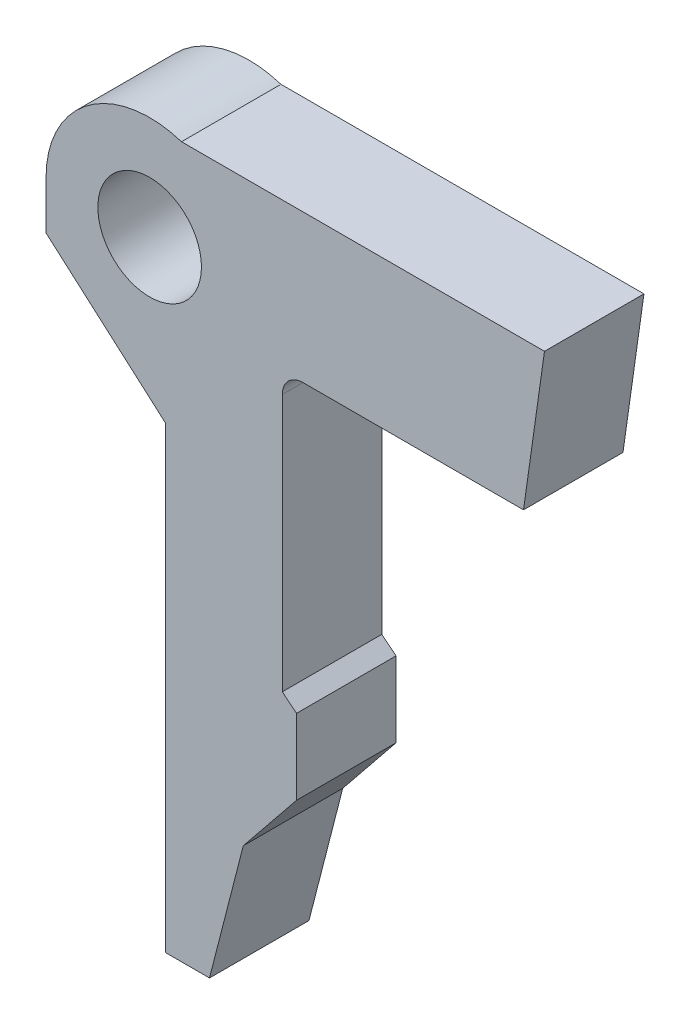
ISO-10303-21;
HEADER;
FILE_DESCRIPTION(('STEP AP214'),'2;1');
FILE_NAME('part.step','',(''),(''),'','','');
FILE_SCHEMA(('AUTOMOTIVE_DESIGN { 1 0 10303 214 1 1 1 1 }'));
ENDSEC;
DATA;
#1=APPLICATION_CONTEXT('core data for automotive mechanical design processes');
#2=APPLICATION_PROTOCOL_DEFINITION('international standard','automotive_design',2000,#1);
#3=PRODUCT_CONTEXT('',#1,'mechanical');
#4=PRODUCT('Part','Part','',(#3));
#5=PRODUCT_RELATED_PRODUCT_CATEGORY('part','',(#4));
#6=PRODUCT_DEFINITION_FORMATION('','',#4);
#7=PRODUCT_DEFINITION_CONTEXT('part definition',#1,'design');
#8=PRODUCT_DEFINITION('design','',#6,#7);
#9=PRODUCT_DEFINITION_SHAPE('','',#8);
#10=(LENGTH_UNIT() NAMED_UNIT(*) SI_UNIT(.MILLI.,.METRE.));
#11=(NAMED_UNIT(*) PLANE_ANGLE_UNIT() SI_UNIT($,.RADIAN.));
#12=(NAMED_UNIT(*) SI_UNIT($,.STERADIAN.) SOLID_ANGLE_UNIT());
#13=UNCERTAINTY_MEASURE_WITH_UNIT(LENGTH_MEASURE(1.E-05),#10,'distance_accuracy_value','');
#14=(GEOMETRIC_REPRESENTATION_CONTEXT(3) GLOBAL_UNCERTAINTY_ASSIGNED_CONTEXT((#13)) GLOBAL_UNIT_ASSIGNED_CONTEXT((#10,
#11,#12)) REPRESENTATION_CONTEXT('',''));
#15=CARTESIAN_POINT('',(0.,0.,0.));
#16=DIRECTION('',(0.,0.,1.));
#17=DIRECTION('',(1.,0.,0.));
#18=AXIS2_PLACEMENT_3D('',#15,#16,#17);
#19=CARTESIAN_POINT('',(6.40208237027269,0.,4.8));
#20=DIRECTION('',(-1.,0.,0.));
#21=DIRECTION('',(0.,-1.,0.));
#22=AXIS2_PLACEMENT_3D('',#19,#20,#21);
#23=PLANE('',#22);
#24=DIRECTION('',(0.,1.,0.));
#25=VECTOR('',#24,1.);
#26=CARTESIAN_POINT('',(6.40208237027269,0.,0.));
#27=LINE('',#26,#25);
#28=CARTESIAN_POINT('',(6.40208237027269,-15.8013424147127,0.));
#29=VERTEX_POINT('',#28);
#30=CARTESIAN_POINT('',(6.40208237027269,-3.37613806837089,0.));
#31=VERTEX_POINT('',#30);
#32=EDGE_CURVE('E171',#29,#31,#27,.T.);
#33=ORIENTED_EDGE('',*,*,#32,.T.);
#34=DIRECTION('',(0.,0.,-1.));
#35=VECTOR('',#34,1.);
#36=CARTESIAN_POINT('',(6.40208237027269,-3.37613806837089,4.8));
#37=LINE('',#36,#35);
#38=CARTESIAN_POINT('',(6.40208237027269,-3.37613806837089,4.8));
#39=VERTEX_POINT('',#38);
#40=EDGE_CURVE('E11',#39,#31,#37,.T.);
#41=ORIENTED_EDGE('',*,*,#40,.F.);
#42=DIRECTION('',(0.,1.,0.));
#43=VECTOR('',#42,1.);
#44=CARTESIAN_POINT('',(6.40208237027269,0.,4.8));
#45=LINE('',#44,#43);
#46=CARTESIAN_POINT('',(6.40208237027269,-15.8013424147127,4.8));
#47=VERTEX_POINT('',#46);
#48=EDGE_CURVE('E201',#47,#39,#45,.T.);
#49=ORIENTED_EDGE('',*,*,#48,.F.);
#50=DIRECTION('',(0.,0.,-1.));
#51=VECTOR('',#50,1.);
#52=CARTESIAN_POINT('',(6.40208237027269,-15.8013424147127,4.8));
#53=LINE('',#52,#51);
#54=EDGE_CURVE('E170',#47,#29,#53,.T.);
#55=ORIENTED_EDGE('',*,*,#54,.T.);
#56=EDGE_LOOP('',(#33,#41,#49,#55));
#57=FACE_BOUND('',#56,.T.);
#58=ADVANCED_FACE('F35',(#57),#23,.F.);
#59=CARTESIAN_POINT('',(7.40208237027269,-3.37613806837089,4.8));
#60=DIRECTION('',(0.,0.,-1.));
#61=DIRECTION('',(-1.,0.,0.));
#62=AXIS2_PLACEMENT_3D('',#59,#60,#61);
#63=CYLINDRICAL_SURFACE('',#62,1.);
#64=CARTESIAN_POINT('',(7.40208237027269,-3.37613806837089,0.));
#65=DIRECTION('',(0.,0.,1.));
#66=DIRECTION('',(1.,0.,0.));
#67=AXIS2_PLACEMENT_3D('',#64,#65,#66);
#68=CIRCLE('',#67,1.);
#69=CARTESIAN_POINT('',(7.40208237027269,-2.37613806837089,0.));
#70=VERTEX_POINT('',#69);
#71=EDGE_CURVE('E174',#31,#70,#68,.F.);
#72=ORIENTED_EDGE('',*,*,#71,.T.);
#73=DIRECTION('',(0.,0.,-1.));
#74=VECTOR('',#73,1.);
#75=CARTESIAN_POINT('',(7.40208237027269,-2.37613806837089,4.8));
#76=LINE('',#75,#74);
#77=CARTESIAN_POINT('',(7.40208237027269,-2.37613806837089,4.8));
#78=VERTEX_POINT('',#77);
#79=EDGE_CURVE('E43',#78,#70,#76,.T.);
#80=ORIENTED_EDGE('',*,*,#79,.F.);
#81=CARTESIAN_POINT('',(7.40208237027269,-3.37613806837089,4.8));
#82=DIRECTION('',(0.,0.,1.));
#83=DIRECTION('',(1.,0.,0.));
#84=AXIS2_PLACEMENT_3D('',#81,#82,#83);
#85=CIRCLE('',#84,1.);
#86=EDGE_CURVE('E112',#39,#78,#85,.F.);
#87=ORIENTED_EDGE('',*,*,#86,.F.);
#88=ORIENTED_EDGE('',*,*,#40,.T.);
#89=EDGE_LOOP('',(#72,#80,#87,#88));
#90=FACE_BOUND('',#89,.T.);
#91=ADVANCED_FACE('F291',(#90),#63,.F.);
#92=CARTESIAN_POINT('',(0.,-2.37613806837089,4.8));
#93=DIRECTION('',(0.,1.,0.));
#94=DIRECTION('',(0.,0.,1.));
#95=AXIS2_PLACEMENT_3D('',#92,#93,#94);
#96=PLANE('',#95);
#97=DIRECTION('',(1.,0.,0.));
#98=VECTOR('',#97,1.);
#99=CARTESIAN_POINT('',(0.,-2.37613806837089,0.));
#100=LINE('',#99,#98);
#101=CARTESIAN_POINT('',(18.0439607931068,-2.37613806837089,0.));
#102=VERTEX_POINT('',#101);
#103=EDGE_CURVE('E177',#70,#102,#100,.T.);
#104=ORIENTED_EDGE('',*,*,#103,.T.);
#105=DIRECTION('',(0.,0.,-1.));
#106=VECTOR('',#105,1.);
#107=CARTESIAN_POINT('',(18.0439607931068,-2.37613806837089,4.8));
#108=LINE('',#107,#106);
#109=CARTESIAN_POINT('',(18.0439607931068,-2.37613806837089,4.8));
#110=VERTEX_POINT('',#109);
#111=EDGE_CURVE('E226',#110,#102,#108,.T.);
#112=ORIENTED_EDGE('',*,*,#111,.F.);
#113=DIRECTION('',(1.,0.,0.));
#114=VECTOR('',#113,1.);
#115=CARTESIAN_POINT('',(0.,-2.37613806837089,4.8));
#116=LINE('',#115,#114);
#117=EDGE_CURVE('E234',#78,#110,#116,.T.);
#118=ORIENTED_EDGE('',*,*,#117,.F.);
#119=ORIENTED_EDGE('',*,*,#79,.T.);
#120=EDGE_LOOP('',(#104,#112,#118,#119));
#121=FACE_BOUND('',#120,.T.);
#122=ADVANCED_FACE('F232',(#121),#96,.F.);
#123=CARTESIAN_POINT('',(18.0184346235268,-2.55607840833381,4.8));
#124=DIRECTION('',(-0.990087364863809,0.140452874434947,0.));
#125=DIRECTION('',(-0.140452874434947,-0.990087364863809,0.));
#126=AXIS2_PLACEMENT_3D('',#123,#124,#125);
#127=PLANE('',#126);
#128=DIRECTION('',(0.140452874434947,0.990087364863809,0.));
#129=VECTOR('',#128,1.);
#130=CARTESIAN_POINT('',(18.0184346235268,-2.55607840833381,0.));
#131=LINE('',#130,#129);
#132=CARTESIAN_POINT('',(19.0560025989645,4.7579971974597,0.));
#133=VERTEX_POINT('',#132);
#134=EDGE_CURVE('E179',#102,#133,#131,.T.);
#135=ORIENTED_EDGE('',*,*,#134,.T.);
#136=DIRECTION('',(0.,0.,-1.));
#137=VECTOR('',#136,1.);
#138=CARTESIAN_POINT('',(19.0560025989645,4.7579971974597,4.8));
#139=LINE('',#138,#137);
#140=CARTESIAN_POINT('',(19.0560025989645,4.7579971974597,4.8));
#141=VERTEX_POINT('',#140);
#142=EDGE_CURVE('E223',#141,#133,#139,.T.);
#143=ORIENTED_EDGE('',*,*,#142,.F.);
#144=DIRECTION('',(0.140452874434947,0.990087364863809,0.));
#145=VECTOR('',#144,1.);
#146=CARTESIAN_POINT('',(18.0184346235268,-2.55607840833381,4.8));
#147=LINE('',#146,#145);
#148=EDGE_CURVE('E253',#110,#141,#147,.T.);
#149=ORIENTED_EDGE('',*,*,#148,.F.);
#150=ORIENTED_EDGE('',*,*,#111,.T.);
#151=EDGE_LOOP('',(#135,#143,#149,#150));
#152=FACE_BOUND('',#151,.T.);
#153=ADVANCED_FACE('F244',(#152),#127,.F.);
#154=CARTESIAN_POINT('',(0.,4.7579971974597,4.8));
#155=DIRECTION('',(0.,-1.,0.));
#156=DIRECTION('',(0.,0.,-1.));
#157=AXIS2_PLACEMENT_3D('',#154,#155,#156);
#158=PLANE('',#157);
#159=DIRECTION('',(-1.,0.,0.));
#160=VECTOR('',#159,1.);
#161=CARTESIAN_POINT('',(0.,4.7579971974597,0.));
#162=LINE('',#161,#160);
#163=CARTESIAN_POINT('',(1.53670513403374,4.7579971974597,0.));
#164=VERTEX_POINT('',#163);
#165=EDGE_CURVE('E181',#133,#164,#162,.T.);
#166=ORIENTED_EDGE('',*,*,#165,.T.);
#167=DIRECTION('',(0.,0.,-1.));
#168=VECTOR('',#167,1.);
#169=CARTESIAN_POINT('',(1.53670513403374,4.7579971974597,4.8));
#170=LINE('',#169,#168);
#171=CARTESIAN_POINT('',(1.53670513403374,4.7579971974597,4.8));
#172=VERTEX_POINT('',#171);
#173=EDGE_CURVE('E220',#172,#164,#170,.T.);
#174=ORIENTED_EDGE('',*,*,#173,.F.);
#175=DIRECTION('',(-1.,0.,0.));
#176=VECTOR('',#175,1.);
#177=CARTESIAN_POINT('',(0.,4.7579971974597,4.8));
#178=LINE('',#177,#176);
#179=EDGE_CURVE('E250',#141,#172,#178,.T.);
#180=ORIENTED_EDGE('',*,*,#179,.F.);
#181=ORIENTED_EDGE('',*,*,#142,.T.);
#182=EDGE_LOOP('',(#166,#174,#180,#181));
#183=FACE_BOUND('',#182,.T.);
#184=ADVANCED_FACE('F248',(#183),#158,.F.);
#185=CARTESIAN_POINT('',(0.,0.,4.8));
#186=DIRECTION('',(0.,0.,-1.));
#187=DIRECTION('',(-1.,0.,0.));
#188=AXIS2_PLACEMENT_3D('',#185,#186,#187);
#189=CYLINDRICAL_SURFACE('',#188,5.);
#190=CARTESIAN_POINT('',(0.,0.,0.));
#191=DIRECTION('',(0.,0.,1.));
#192=DIRECTION('',(1.,0.,0.));
#193=AXIS2_PLACEMENT_3D('',#190,#191,#192);
#194=CIRCLE('',#193,5.);
#195=CARTESIAN_POINT('',(-5.,0.,0.));
#196=VERTEX_POINT('',#195);
#197=EDGE_CURVE('E183',#164,#196,#194,.T.);
#198=ORIENTED_EDGE('',*,*,#197,.T.);
#199=DIRECTION('',(0.,0.,-1.));
#200=VECTOR('',#199,1.);
#201=CARTESIAN_POINT('',(-5.,0.,4.8));
#202=LINE('',#201,#200);
#203=CARTESIAN_POINT('',(-5.,0.,4.8));
#204=VERTEX_POINT('',#203);
#205=EDGE_CURVE('E217',#204,#196,#202,.T.);
#206=ORIENTED_EDGE('',*,*,#205,.F.);
#207=CARTESIAN_POINT('',(0.,0.,4.8));
#208=DIRECTION('',(0.,0.,1.));
#209=DIRECTION('',(1.,0.,0.));
#210=AXIS2_PLACEMENT_3D('',#207,#208,#209);
#211=CIRCLE('',#210,5.);
#212=EDGE_CURVE('E252',#172,#204,#211,.T.);
#213=ORIENTED_EDGE('',*,*,#212,.F.);
#214=ORIENTED_EDGE('',*,*,#173,.T.);
#215=EDGE_LOOP('',(#198,#206,#213,#214));
#216=FACE_BOUND('',#215,.T.);
#217=ADVANCED_FACE('F304',(#216),#189,.T.);
#218=CARTESIAN_POINT('',(-5.,0.,4.8));
#219=DIRECTION('',(1.,0.,0.));
#220=DIRECTION('',(0.,0.,-1.));
#221=AXIS2_PLACEMENT_3D('',#218,#219,#220);
#222=PLANE('',#221);
#223=DIRECTION('',(0.,-1.,0.));
#224=VECTOR('',#223,1.);
#225=CARTESIAN_POINT('',(-5.,0.,0.));
#226=LINE('',#225,#224);
#227=CARTESIAN_POINT('',(-5.,-2.32647439688253,0.));
#228=VERTEX_POINT('',#227);
#229=EDGE_CURVE('E185',#196,#228,#226,.T.);
#230=ORIENTED_EDGE('',*,*,#229,.T.);
#231=DIRECTION('',(0.,0.,-1.));
#232=VECTOR('',#231,1.);
#233=CARTESIAN_POINT('',(-5.,-2.32647439688253,4.8));
#234=LINE('',#233,#232);
#235=CARTESIAN_POINT('',(-5.,-2.32647439688253,4.8));
#236=VERTEX_POINT('',#235);
#237=EDGE_CURVE('E214',#236,#228,#234,.T.);
#238=ORIENTED_EDGE('',*,*,#237,.F.);
#239=DIRECTION('',(0.,-1.,0.));
#240=VECTOR('',#239,1.);
#241=CARTESIAN_POINT('',(-5.,0.,4.8));
#242=LINE('',#241,#240);
#243=EDGE_CURVE('E255',#204,#236,#242,.T.);
#244=ORIENTED_EDGE('',*,*,#243,.F.);
#245=ORIENTED_EDGE('',*,*,#205,.T.);
#246=EDGE_LOOP('',(#230,#238,#244,#245));
#247=FACE_BOUND('',#246,.T.);
#248=ADVANCED_FACE('F307',(#247),#222,.F.);
#249=CARTESIAN_POINT('',(-3.32960365921922,-3.79285286398016,4.8));
#250=DIRECTION('',(0.659722162079872,0.751509593325767,0.));
#251=DIRECTION('',(-0.751509593325767,0.659722162079872,0.));
#252=AXIS2_PLACEMENT_3D('',#249,#250,#251);
#253=PLANE('',#252);
#254=DIRECTION('',(0.751509593325767,-0.659722162079872,0.));
#255=VECTOR('',#254,1.);
#256=CARTESIAN_POINT('',(-3.32960365921922,-3.79285286398016,0.));
#257=LINE('',#256,#255);
#258=CARTESIAN_POINT('',(0.754164722411706,-7.3778403745722,0.));
#259=VERTEX_POINT('',#258);
#260=EDGE_CURVE('E187',#228,#259,#257,.T.);
#261=ORIENTED_EDGE('',*,*,#260,.T.);
#262=DIRECTION('',(0.,0.,-1.));
#263=VECTOR('',#262,1.);
#264=CARTESIAN_POINT('',(0.754164722411706,-7.3778403745722,4.8));
#265=LINE('',#264,#263);
#266=CARTESIAN_POINT('',(0.754164722411706,-7.3778403745722,4.8));
#267=VERTEX_POINT('',#266);
#268=EDGE_CURVE('E211',#267,#259,#265,.T.);
#269=ORIENTED_EDGE('',*,*,#268,.F.);
#270=DIRECTION('',(0.751509593325767,-0.659722162079872,0.));
#271=VECTOR('',#270,1.);
#272=CARTESIAN_POINT('',(-3.32960365921922,-3.79285286398016,4.8));
#273=LINE('',#272,#271);
#274=EDGE_CURVE('E261',#236,#267,#273,.T.);
#275=ORIENTED_EDGE('',*,*,#274,.F.);
#276=ORIENTED_EDGE('',*,*,#237,.T.);
#277=EDGE_LOOP('',(#261,#269,#275,#276));
#278=FACE_BOUND('',#277,.T.);
#279=ADVANCED_FACE('F311',(#278),#253,.F.);
#280=CARTESIAN_POINT('',(0.754164722411706,0.,4.8));
#281=DIRECTION('',(1.,0.,0.));
#282=DIRECTION('',(0.,0.,-1.));
#283=AXIS2_PLACEMENT_3D('',#280,#281,#282);
#284=PLANE('',#283);
#285=CARTESIAN_POINT('',(0.754164722411706,-27.0198901160511,2.4));
#286=DIRECTION('',(-1.,0.,0.));
#287=DIRECTION('',(0.,0.,1.));
#288=AXIS2_PLACEMENT_3D('',#285,#286,#287);
#289=CIRCLE('',#288,1.825);
#290=CARTESIAN_POINT('',(0.754164722411706,-27.0198901160511,4.225));
#291=VERTEX_POINT('',#290);
#292=EDGE_CURVE('E395',#291,#291,#289,.T.);
#293=ORIENTED_EDGE('',*,*,#292,.F.);
#294=EDGE_LOOP('',(#293));
#295=FACE_BOUND('',#294,.T.);
#296=DIRECTION('',(0.,-1.,0.));
#297=VECTOR('',#296,1.);
#298=CARTESIAN_POINT('',(0.754164722411706,0.,0.));
#299=LINE('',#298,#297);
#300=CARTESIAN_POINT('',(0.754164722411706,-29.5198901160511,0.));
#301=VERTEX_POINT('',#300);
#302=EDGE_CURVE('E189',#259,#301,#299,.T.);
#303=ORIENTED_EDGE('',*,*,#302,.T.);
#304=DIRECTION('',(0.,0.,-1.));
#305=VECTOR('',#304,1.);
#306=CARTESIAN_POINT('',(0.754164722411706,-29.5198901160511,4.8));
#307=LINE('',#306,#305);
#308=CARTESIAN_POINT('',(0.754164722411706,-29.5198901160511,4.8));
#309=VERTEX_POINT('',#308);
#310=EDGE_CURVE('E208',#309,#301,#307,.T.);
#311=ORIENTED_EDGE('',*,*,#310,.F.);
#312=DIRECTION('',(0.,-1.,0.));
#313=VECTOR('',#312,1.);
#314=CARTESIAN_POINT('',(0.754164722411706,0.,4.8));
#315=LINE('',#314,#313);
#316=EDGE_CURVE('E263',#267,#309,#315,.T.);
#317=ORIENTED_EDGE('',*,*,#316,.F.);
#318=ORIENTED_EDGE('',*,*,#268,.T.);
#319=EDGE_LOOP('',(#303,#311,#317,#318));
#320=FACE_BOUND('',#319,.T.);
#321=ADVANCED_FACE('F315',(#295,#320),#284,.F.);
#322=CARTESIAN_POINT('',(0.,-29.5198901160511,4.8));
#323=DIRECTION('',(0.,1.,0.));
#324=DIRECTION('',(0.,0.,1.));
#325=AXIS2_PLACEMENT_3D('',#322,#323,#324);
#326=PLANE('',#325);
#327=DIRECTION('',(1.,0.,0.));
#328=VECTOR('',#327,1.);
#329=CARTESIAN_POINT('',(0.,-29.5198901160511,0.));
#330=LINE('',#329,#328);
#331=CARTESIAN_POINT('',(2.88905288160279,-29.5198901160511,0.));
#332=VERTEX_POINT('',#331);
#333=EDGE_CURVE('E191',#301,#332,#330,.T.);
#334=ORIENTED_EDGE('',*,*,#333,.T.);
#335=DIRECTION('',(0.,0.,-1.));
#336=VECTOR('',#335,1.);
#337=CARTESIAN_POINT('',(2.88905288160279,-29.5198901160511,4.8));
#338=LINE('',#337,#336);
#339=CARTESIAN_POINT('',(2.88905288160279,-29.5198901160511,4.8));
#340=VERTEX_POINT('',#339);
#341=EDGE_CURVE('E205',#340,#332,#338,.T.);
#342=ORIENTED_EDGE('',*,*,#341,.F.);
#343=DIRECTION('',(1.,0.,0.));
#344=VECTOR('',#343,1.);
#345=CARTESIAN_POINT('',(0.,-29.5198901160511,4.8));
#346=LINE('',#345,#344);
#347=EDGE_CURVE('E265',#309,#340,#346,.T.);
#348=ORIENTED_EDGE('',*,*,#347,.F.);
#349=ORIENTED_EDGE('',*,*,#310,.T.);
#350=EDGE_LOOP('',(#334,#342,#348,#349));
#351=FACE_BOUND('',#350,.T.);
#352=ADVANCED_FACE('F271',(#351),#326,.F.);
#353=CARTESIAN_POINT('',(9.82465163114794,-2.52409050886445,4.8));
#354=DIRECTION('',(-0.968546374107557,0.248833119184534,0.));
#355=DIRECTION('',(-0.248833119184534,-0.968546374107557,0.));
#356=AXIS2_PLACEMENT_3D('',#353,#354,#355);
#357=PLANE('',#356);
#358=DIRECTION('',(0.248833119184534,0.968546374107557,0.));
#359=VECTOR('',#358,1.);
#360=CARTESIAN_POINT('',(9.82465163114794,-2.52409050886445,0.));
#361=LINE('',#360,#359);
#362=CARTESIAN_POINT('',(4.51852156443268,-23.1774225633041,0.));
#363=VERTEX_POINT('',#362);
#364=EDGE_CURVE('E193',#332,#363,#361,.T.);
#365=ORIENTED_EDGE('',*,*,#364,.T.);
#366=DIRECTION('',(0.,0.,-1.));
#367=VECTOR('',#366,1.);
#368=CARTESIAN_POINT('',(4.51852156443268,-23.1774225633041,4.8));
#369=LINE('',#368,#367);
#370=CARTESIAN_POINT('',(4.51852156443268,-23.1774225633041,4.8));
#371=VERTEX_POINT('',#370);
#372=EDGE_CURVE('E159',#371,#363,#369,.T.);
#373=ORIENTED_EDGE('',*,*,#372,.F.);
#374=DIRECTION('',(0.248833119184534,0.968546374107557,0.));
#375=VECTOR('',#374,1.);
#376=CARTESIAN_POINT('',(9.82465163114794,-2.52409050886445,4.8));
#377=LINE('',#376,#375);
#378=EDGE_CURVE('E150',#340,#371,#377,.T.);
#379=ORIENTED_EDGE('',*,*,#378,.F.);
#380=ORIENTED_EDGE('',*,*,#341,.T.);
#381=EDGE_LOOP('',(#365,#373,#379,#380));
#382=FACE_BOUND('',#381,.T.);
#383=ADVANCED_FACE('F275',(#382),#357,.F.);
#384=CARTESIAN_POINT('',(14.0636657935464,-11.3468212652477,4.8));
#385=DIRECTION('',(-0.778273612677989,0.627925301137923,0.));
#386=DIRECTION('',(-0.627925301137924,-0.778273612677989,0.));
#387=AXIS2_PLACEMENT_3D('',#384,#385,#386);
#388=PLANE('',#387);
#389=DIRECTION('',(0.627925301137924,0.778273612677989,0.));
#390=VECTOR('',#389,1.);
#391=CARTESIAN_POINT('',(14.0636657935464,-11.3468212652477,0.));
#392=LINE('',#391,#390);
#393=CARTESIAN_POINT('',(7.08991093954301,-19.9903484082378,0.));
#394=VERTEX_POINT('',#393);
#395=EDGE_CURVE('E158',#363,#394,#392,.T.);
#396=ORIENTED_EDGE('',*,*,#395,.T.);
#397=DIRECTION('',(0.,0.,-1.));
#398=VECTOR('',#397,1.);
#399=CARTESIAN_POINT('',(7.08991093954301,-19.9903484082378,4.8));
#400=LINE('',#399,#398);
#401=CARTESIAN_POINT('',(7.08991093954301,-19.9903484082378,4.8));
#402=VERTEX_POINT('',#401);
#403=EDGE_CURVE('E155',#402,#394,#400,.T.);
#404=ORIENTED_EDGE('',*,*,#403,.F.);
#405=DIRECTION('',(0.627925301137924,0.778273612677989,0.));
#406=VECTOR('',#405,1.);
#407=CARTESIAN_POINT('',(14.0636657935464,-11.3468212652477,4.8));
#408=LINE('',#407,#406);
#409=EDGE_CURVE('E143',#371,#402,#408,.T.);
#410=ORIENTED_EDGE('',*,*,#409,.F.);
#411=ORIENTED_EDGE('',*,*,#372,.T.);
#412=EDGE_LOOP('',(#396,#404,#410,#411));
#413=FACE_BOUND('',#412,.T.);
#414=ADVANCED_FACE('F156',(#413),#388,.F.);
#415=CARTESIAN_POINT('',(7.08991093954301,0.,4.8));
#416=DIRECTION('',(-1.,0.,0.));
#417=DIRECTION('',(0.,0.,1.));
#418=AXIS2_PLACEMENT_3D('',#415,#416,#417);
#419=PLANE('',#418);
#420=DIRECTION('',(0.,1.,0.));
#421=VECTOR('',#420,1.);
#422=CARTESIAN_POINT('',(7.08991093954301,0.,0.));
#423=LINE('',#422,#421);
#424=CARTESIAN_POINT('',(7.08991093954301,-16.356295010374,0.));
#425=VERTEX_POINT('',#424);
#426=EDGE_CURVE('E98',#394,#425,#423,.T.);
#427=ORIENTED_EDGE('',*,*,#426,.T.);
#428=DIRECTION('',(0.,0.,-1.));
#429=VECTOR('',#428,1.);
#430=CARTESIAN_POINT('',(7.08991093954301,-16.356295010374,4.8));
#431=LINE('',#430,#429);
#432=CARTESIAN_POINT('',(7.08991093954301,-16.356295010374,4.8));
#433=VERTEX_POINT('',#432);
#434=EDGE_CURVE('E160',#433,#425,#431,.T.);
#435=ORIENTED_EDGE('',*,*,#434,.F.);
#436=DIRECTION('',(0.,1.,0.));
#437=VECTOR('',#436,1.);
#438=CARTESIAN_POINT('',(7.08991093954301,0.,4.8));
#439=LINE('',#438,#437);
#440=EDGE_CURVE('E148',#402,#433,#439,.T.);
#441=ORIENTED_EDGE('',*,*,#440,.F.);
#442=ORIENTED_EDGE('',*,*,#403,.T.);
#443=EDGE_LOOP('',(#427,#435,#441,#442));
#444=FACE_BOUND('',#443,.T.);
#445=ADVANCED_FACE('F162',(#444),#419,.F.);
#446=CARTESIAN_POINT('',(-5.19780134365117,-6.44234532734231,4.8));
#447=DIRECTION('',(-0.627925301137923,-0.778273612677989,0.));
#448=DIRECTION('',(0.778273612677989,-0.627925301137923,0.));
#449=AXIS2_PLACEMENT_3D('',#446,#447,#448);
#450=PLANE('',#449);
#451=DIRECTION('',(-0.778273612677989,0.627925301137923,0.));
#452=VECTOR('',#451,1.);
#453=CARTESIAN_POINT('',(-5.19780134365117,-6.44234532734231,0.));
#454=LINE('',#453,#452);
#455=EDGE_CURVE('E104',#425,#29,#454,.T.);
#456=ORIENTED_EDGE('',*,*,#455,.T.);
#457=ORIENTED_EDGE('',*,*,#54,.F.);
#458=DIRECTION('',(-0.778273612677989,0.627925301137923,0.));
#459=VECTOR('',#458,1.);
#460=CARTESIAN_POINT('',(-5.19780134365117,-6.44234532734231,4.8));
#461=LINE('',#460,#459);
#462=EDGE_CURVE('E51',#433,#47,#461,.T.);
#463=ORIENTED_EDGE('',*,*,#462,.F.);
#464=ORIENTED_EDGE('',*,*,#434,.T.);
#465=EDGE_LOOP('',(#456,#457,#463,#464));
#466=FACE_BOUND('',#465,.T.);
#467=ADVANCED_FACE('F279',(#466),#450,.F.);
#468=CARTESIAN_POINT('',(0.,0.,4.8));
#469=DIRECTION('',(0.,0.,-1.));
#470=DIRECTION('',(-1.,0.,0.));
#471=AXIS2_PLACEMENT_3D('',#468,#469,#470);
#472=CYLINDRICAL_SURFACE('',#471,2.5);
#473=CARTESIAN_POINT('',(0.,0.,4.8));
#474=DIRECTION('',(0.,0.,1.));
#475=DIRECTION('',(1.,0.,0.));
#476=AXIS2_PLACEMENT_3D('',#473,#474,#475);
#477=CIRCLE('',#476,2.5);
#478=CARTESIAN_POINT('',(2.5,0.,4.8));
#479=VERTEX_POINT('',#478);
#480=EDGE_CURVE('E164',#479,#479,#477,.T.);
#481=ORIENTED_EDGE('',*,*,#480,.T.);
#482=EDGE_LOOP('',(#481));
#483=FACE_BOUND('',#482,.T.);
#484=CARTESIAN_POINT('',(0.,0.,0.));
#485=DIRECTION('',(0.,0.,1.));
#486=DIRECTION('',(1.,0.,0.));
#487=AXIS2_PLACEMENT_3D('',#484,#485,#486);
#488=CIRCLE('',#487,2.5);
#489=CARTESIAN_POINT('',(2.5,0.,0.));
#490=VERTEX_POINT('',#489);
#491=EDGE_CURVE('E198',#490,#490,#488,.T.);
#492=ORIENTED_EDGE('',*,*,#491,.F.);
#493=EDGE_LOOP('',(#492));
#494=FACE_BOUND('',#493,.T.);
#495=ADVANCED_FACE('F281',(#483,#494),#472,.F.);
#496=CARTESIAN_POINT('',(0.,0.,4.8));
#497=DIRECTION('',(0.,0.,1.));
#498=DIRECTION('',(1.,0.,0.));
#499=AXIS2_PLACEMENT_3D('',#496,#497,#498);
#500=PLANE('',#499);
#501=ORIENTED_EDGE('',*,*,#48,.T.);
#502=ORIENTED_EDGE('',*,*,#86,.T.);
#503=ORIENTED_EDGE('',*,*,#117,.T.);
#504=ORIENTED_EDGE('',*,*,#148,.T.);
#505=ORIENTED_EDGE('',*,*,#179,.T.);
#506=ORIENTED_EDGE('',*,*,#212,.T.);
#507=ORIENTED_EDGE('',*,*,#243,.T.);
#508=ORIENTED_EDGE('',*,*,#274,.T.);
#509=ORIENTED_EDGE('',*,*,#316,.T.);
#510=ORIENTED_EDGE('',*,*,#347,.T.);
#511=ORIENTED_EDGE('',*,*,#378,.T.);
#512=ORIENTED_EDGE('',*,*,#409,.T.);
#513=ORIENTED_EDGE('',*,*,#440,.T.);
#514=ORIENTED_EDGE('',*,*,#462,.T.);
#515=EDGE_LOOP('',(#501,#502,#503,#504,#505,#506,#507,#508,#509,#510,#511,#512,#513,#514));
#516=FACE_BOUND('',#515,.T.);
#517=ORIENTED_EDGE('',*,*,#480,.F.);
#518=EDGE_LOOP('',(#517));
#519=FACE_BOUND('',#518,.T.);
#520=ADVANCED_FACE('F145',(#516,#519),#500,.T.);
#521=CARTESIAN_POINT('',(0.,0.,0.));
#522=DIRECTION('',(0.,0.,1.));
#523=DIRECTION('',(1.,0.,0.));
#524=AXIS2_PLACEMENT_3D('',#521,#522,#523);
#525=PLANE('',#524);
#526=ORIENTED_EDGE('',*,*,#32,.F.);
#527=ORIENTED_EDGE('',*,*,#455,.F.);
#528=ORIENTED_EDGE('',*,*,#426,.F.);
#529=ORIENTED_EDGE('',*,*,#395,.F.);
#530=ORIENTED_EDGE('',*,*,#364,.F.);
#531=ORIENTED_EDGE('',*,*,#333,.F.);
#532=ORIENTED_EDGE('',*,*,#302,.F.);
#533=ORIENTED_EDGE('',*,*,#260,.F.);
#534=ORIENTED_EDGE('',*,*,#229,.F.);
#535=ORIENTED_EDGE('',*,*,#197,.F.);
#536=ORIENTED_EDGE('',*,*,#165,.F.);
#537=ORIENTED_EDGE('',*,*,#134,.F.);
#538=ORIENTED_EDGE('',*,*,#103,.F.);
#539=ORIENTED_EDGE('',*,*,#71,.F.);
#540=EDGE_LOOP('',(#526,#527,#528,#529,#530,#531,#532,#533,#534,#535,#536,#537,#538,#539));
#541=FACE_BOUND('',#540,.T.);
#542=ORIENTED_EDGE('',*,*,#491,.T.);
#543=EDGE_LOOP('',(#542));
#544=FACE_BOUND('',#543,.T.);
#545=ADVANCED_FACE('F238',(#541,#544),#525,.F.);
#546=CARTESIAN_POINT('',(2.75416472241171,-27.0198901160511,2.4));
#547=DIRECTION('',(-1.,0.,0.));
#548=DIRECTION('',(0.,0.,1.));
#549=AXIS2_PLACEMENT_3D('',#546,#547,#548);
#550=CYLINDRICAL_SURFACE('',#549,1.825);
#551=CARTESIAN_POINT('',(2.75416472241171,-27.0198901160511,2.4));
#552=DIRECTION('',(-1.,0.,0.));
#553=DIRECTION('',(0.,0.,1.));
#554=AXIS2_PLACEMENT_3D('',#551,#552,#553);
#555=CIRCLE('',#554,1.825);
#556=CARTESIAN_POINT('',(2.75416472241171,-27.0198901160511,4.225));
#557=VERTEX_POINT('',#556);
#558=EDGE_CURVE('E175',#557,#557,#555,.T.);
#559=ORIENTED_EDGE('',*,*,#558,.F.);
#560=EDGE_LOOP('',(#559));
#561=FACE_BOUND('',#560,.T.);
#562=ORIENTED_EDGE('',*,*,#292,.T.);
#563=EDGE_LOOP('',(#562));
#564=FACE_BOUND('',#563,.T.);
#565=ADVANCED_FACE('F362',(#561,#564),#550,.F.);
#566=CARTESIAN_POINT('',(2.75416472241171,-27.0198901160511,2.4));
#567=DIRECTION('',(-1.,0.,0.));
#568=DIRECTION('',(0.,0.,1.));
#569=AXIS2_PLACEMENT_3D('',#566,#567,#568);
#570=PLANE('',#569);
#571=ORIENTED_EDGE('',*,*,#558,.T.);
#572=EDGE_LOOP('',(#571));
#573=FACE_BOUND('',#572,.T.);
#574=ADVANCED_FACE('F379',(#573),#570,.T.);
#575=CLOSED_SHELL('',(#58,#91,#122,#153,#184,#217,#248,#279,#321,#352,#383,#414,#445,#467,#495,
#520,#545,#565,#574));
#576=MANIFOLD_SOLID_BREP('B2',#575);
#577=ADVANCED_BREP_SHAPE_REPRESENTATION('',(#18,#576),#14);
#578=SHAPE_DEFINITION_REPRESENTATION(#9,#577);
ENDSEC;
END-ISO-10303-21;
